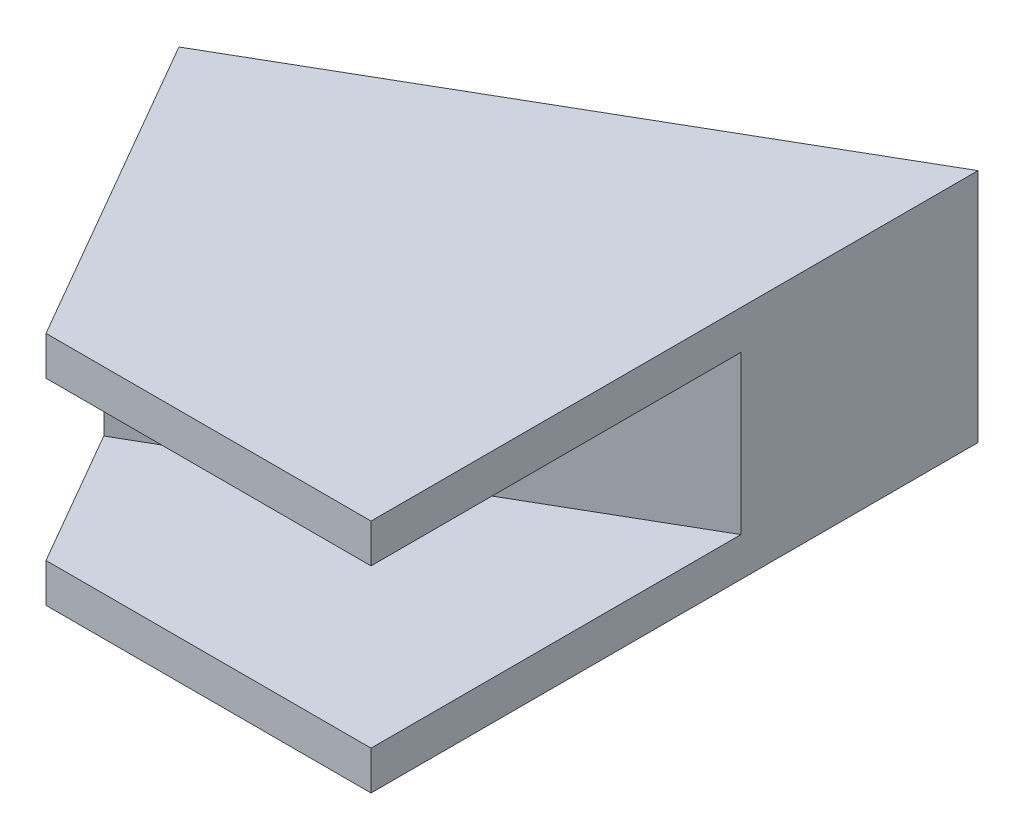
ISO-10303-21;
HEADER;
FILE_DESCRIPTION(('STEP AP214'),'2;1');
FILE_NAME('part.step','',(''),(''),'','','');
FILE_SCHEMA(('AUTOMOTIVE_DESIGN { 1 0 10303 214 1 1 1 1 }'));
ENDSEC;
DATA;
#1=APPLICATION_CONTEXT('core data for automotive mechanical design processes');
#2=APPLICATION_PROTOCOL_DEFINITION('international standard','automotive_design',2000,#1);
#3=PRODUCT_CONTEXT('',#1,'mechanical');
#4=PRODUCT('Part','Part','',(#3));
#5=PRODUCT_RELATED_PRODUCT_CATEGORY('part','',(#4));
#6=PRODUCT_DEFINITION_FORMATION('','',#4);
#7=PRODUCT_DEFINITION_CONTEXT('part definition',#1,'design');
#8=PRODUCT_DEFINITION('design','',#6,#7);
#9=PRODUCT_DEFINITION_SHAPE('','',#8);
#10=(LENGTH_UNIT() NAMED_UNIT(*) SI_UNIT(.MILLI.,.METRE.));
#11=(NAMED_UNIT(*) PLANE_ANGLE_UNIT() SI_UNIT($,.RADIAN.));
#12=(NAMED_UNIT(*) SI_UNIT($,.STERADIAN.) SOLID_ANGLE_UNIT());
#13=UNCERTAINTY_MEASURE_WITH_UNIT(LENGTH_MEASURE(1.E-05),#10,'distance_accuracy_value','');
#14=(GEOMETRIC_REPRESENTATION_CONTEXT(3) GLOBAL_UNCERTAINTY_ASSIGNED_CONTEXT((#13)) GLOBAL_UNIT_ASSIGNED_CONTEXT((#10,
#11,#12)) REPRESENTATION_CONTEXT('',''));
#15=CARTESIAN_POINT('',(0.,0.,0.));
#16=DIRECTION('',(0.,0.,1.));
#17=DIRECTION('',(1.,0.,0.));
#18=AXIS2_PLACEMENT_3D('',#15,#16,#17);
#19=CARTESIAN_POINT('',(0.,5.,0.));
#20=DIRECTION('',(0.,-1.,0.));
#21=DIRECTION('',(0.,0.,-1.));
#22=AXIS2_PLACEMENT_3D('',#19,#20,#21);
#23=PLANE('',#22);
#24=DIRECTION('',(0.866025403784439,0.,-0.5));
#25=VECTOR('',#24,1.);
#26=CARTESIAN_POINT('',(-51.9615242270662,5.,6.55957907090129));
#27=LINE('',#26,#25);
#28=CARTESIAN_POINT('',(-51.9615242270662,5.,6.55957907090129));
#29=VERTEX_POINT('',#28);
#30=CARTESIAN_POINT('',(0.,5.,-23.4404209290987));
#31=VERTEX_POINT('',#30);
#32=EDGE_CURVE('E48',#29,#31,#27,.T.);
#33=ORIENTED_EDGE('',*,*,#32,.F.);
#34=DIRECTION('',(0.500000000000003,0.,0.866025403784437));
#35=VECTOR('',#34,1.);
#36=CARTESIAN_POINT('',(-54.4615242270663,5.,2.22945205197908));
#37=LINE('',#36,#35);
#38=CARTESIAN_POINT('',(-41.8115242270663,5.,24.1398947677253));
#39=VERTEX_POINT('',#38);
#40=EDGE_CURVE('E94',#29,#39,#37,.T.);
#41=ORIENTED_EDGE('',*,*,#40,.T.);
#42=DIRECTION('',(1.,0.,0.));
#43=VECTOR('',#42,1.);
#44=CARTESIAN_POINT('',(-41.8115242270663,5.,24.1398947677253));
#45=LINE('',#44,#43);
#46=CARTESIAN_POINT('',(0.,5.,24.1398947677253));
#47=VERTEX_POINT('',#46);
#48=EDGE_CURVE('E54',#39,#47,#45,.T.);
#49=ORIENTED_EDGE('',*,*,#48,.T.);
#50=DIRECTION('',(0.,0.,-1.));
#51=VECTOR('',#50,1.);
#52=CARTESIAN_POINT('',(0.,5.,24.1398947677253));
#53=LINE('',#52,#51);
#54=EDGE_CURVE('E101',#47,#31,#53,.T.);
#55=ORIENTED_EDGE('',*,*,#54,.T.);
#56=EDGE_LOOP('',(#33,#41,#49,#55));
#57=FACE_BOUND('',#56,.T.);
#58=ADVANCED_FACE('F33',(#57),#23,.F.);
#59=CARTESIAN_POINT('',(-54.4615242270663,5.,2.22945205197908));
#60=DIRECTION('',(0.866025403784438,0.,-0.5));
#61=DIRECTION('',(-0.5,0.,-0.866025403784438));
#62=AXIS2_PLACEMENT_3D('',#59,#60,#61);
#63=PLANE('',#62);
#64=DIRECTION('',(0.5,0.,0.866025403784438));
#65=VECTOR('',#64,1.);
#66=CARTESIAN_POINT('',(-54.4615242270663,0.,2.22945205197908));
#67=LINE('',#66,#65);
#68=CARTESIAN_POINT('',(-65.1667800070896,0.,-16.3125948670415));
#69=VERTEX_POINT('',#68);
#70=CARTESIAN_POINT('',(-41.8115242270663,0.,24.1398947677253));
#71=VERTEX_POINT('',#70);
#72=EDGE_CURVE('E73',#69,#71,#67,.T.);
#73=ORIENTED_EDGE('',*,*,#72,.T.);
#74=DIRECTION('',(0.,-1.,0.));
#75=VECTOR('',#74,1.);
#76=CARTESIAN_POINT('',(-41.8115242270663,5.,24.1398947677253));
#77=LINE('',#76,#75);
#78=EDGE_CURVE('E11',#39,#71,#77,.T.);
#79=ORIENTED_EDGE('',*,*,#78,.F.);
#80=ORIENTED_EDGE('',*,*,#40,.F.);
#81=DIRECTION('',(0.,-1.,0.));
#82=VECTOR('',#81,1.);
#83=CARTESIAN_POINT('',(-51.9615242270662,25.3,6.55957907090129));
#84=LINE('',#83,#82);
#85=CARTESIAN_POINT('',(-51.9615242270662,25.3,6.55957907090129));
#86=VERTEX_POINT('',#85);
#87=EDGE_CURVE('E82',#86,#29,#84,.T.);
#88=ORIENTED_EDGE('',*,*,#87,.F.);
#89=DIRECTION('',(0.500000000000002,0.,0.866025403784438));
#90=VECTOR('',#89,1.);
#91=CARTESIAN_POINT('',(-65.1667800070896,25.3,-16.3125948670415));
#92=LINE('',#91,#90);
#93=CARTESIAN_POINT('',(-41.8115242270663,25.3,24.1398947677253));
#94=VERTEX_POINT('',#93);
#95=EDGE_CURVE('E139',#86,#94,#92,.T.);
#96=ORIENTED_EDGE('',*,*,#95,.T.);
#97=DIRECTION('',(0.,-1.,0.));
#98=VECTOR('',#97,1.);
#99=CARTESIAN_POINT('',(-41.8115242270663,30.3,24.1398947677253));
#100=LINE('',#99,#98);
#101=CARTESIAN_POINT('',(-41.8115242270663,30.3,24.1398947677253));
#102=VERTEX_POINT('',#101);
#103=EDGE_CURVE('E123',#102,#94,#100,.T.);
#104=ORIENTED_EDGE('',*,*,#103,.F.);
#105=DIRECTION('',(0.500000000000002,0.,0.866025403784438));
#106=VECTOR('',#105,1.);
#107=CARTESIAN_POINT('',(-65.1667800070896,30.3,-16.3125948670415));
#108=LINE('',#107,#106);
#109=CARTESIAN_POINT('',(-65.1667800070896,30.3,-16.3125948670415));
#110=VERTEX_POINT('',#109);
#111=EDGE_CURVE('E99',#110,#102,#108,.T.);
#112=ORIENTED_EDGE('',*,*,#111,.F.);
#113=DIRECTION('',(0.,-1.,0.));
#114=VECTOR('',#113,1.);
#115=CARTESIAN_POINT('',(-65.1667800070896,5.,-16.3125948670415));
#116=LINE('',#115,#114);
#117=EDGE_CURVE('E90',#110,#69,#116,.T.);
#118=ORIENTED_EDGE('',*,*,#117,.T.);
#119=EDGE_LOOP('',(#73,#79,#80,#88,#96,#104,#112,#118));
#120=FACE_BOUND('',#119,.T.);
#121=ADVANCED_FACE('F35',(#120),#63,.F.);
#122=CARTESIAN_POINT('',(-41.8115242270663,5.,24.1398947677253));
#123=DIRECTION('',(0.,0.,-1.));
#124=DIRECTION('',(-1.,0.,0.));
#125=AXIS2_PLACEMENT_3D('',#122,#123,#124);
#126=PLANE('',#125);
#127=DIRECTION('',(1.,0.,0.));
#128=VECTOR('',#127,1.);
#129=CARTESIAN_POINT('',(-41.8115242270663,0.,24.1398947677253));
#130=LINE('',#129,#128);
#131=CARTESIAN_POINT('',(0.,0.,24.1398947677253));
#132=VERTEX_POINT('',#131);
#133=EDGE_CURVE('E78',#71,#132,#130,.T.);
#134=ORIENTED_EDGE('',*,*,#133,.T.);
#135=DIRECTION('',(0.,-1.,0.));
#136=VECTOR('',#135,1.);
#137=CARTESIAN_POINT('',(0.,5.,24.1398947677253));
#138=LINE('',#137,#136);
#139=EDGE_CURVE('E41',#47,#132,#138,.T.);
#140=ORIENTED_EDGE('',*,*,#139,.F.);
#141=ORIENTED_EDGE('',*,*,#48,.F.);
#142=ORIENTED_EDGE('',*,*,#78,.T.);
#143=EDGE_LOOP('',(#134,#140,#141,#142));
#144=FACE_BOUND('',#143,.T.);
#145=ADVANCED_FACE('F112',(#144),#126,.F.);
#146=CARTESIAN_POINT('',(0.,5.,-53.9366528463561));
#147=DIRECTION('',(-1.,0.,0.));
#148=DIRECTION('',(0.,0.,1.));
#149=AXIS2_PLACEMENT_3D('',#146,#147,#148);
#150=PLANE('',#149);
#151=DIRECTION('',(0.,0.,-1.));
#152=VECTOR('',#151,1.);
#153=CARTESIAN_POINT('',(0.,0.,-53.9366528463561));
#154=LINE('',#153,#152);
#155=CARTESIAN_POINT('',(0.,0.,-53.9366528463561));
#156=VERTEX_POINT('',#155);
#157=EDGE_CURVE('E95',#132,#156,#154,.T.);
#158=ORIENTED_EDGE('',*,*,#157,.T.);
#159=DIRECTION('',(0.,-1.,0.));
#160=VECTOR('',#159,1.);
#161=CARTESIAN_POINT('',(0.,5.,-53.9366528463561));
#162=LINE('',#161,#160);
#163=CARTESIAN_POINT('',(0.,30.3,-53.9366528463561));
#164=VERTEX_POINT('',#163);
#165=EDGE_CURVE('E93',#164,#156,#162,.T.);
#166=ORIENTED_EDGE('',*,*,#165,.F.);
#167=DIRECTION('',(0.,0.,-1.));
#168=VECTOR('',#167,1.);
#169=CARTESIAN_POINT('',(0.,30.3,24.1398947677253));
#170=LINE('',#169,#168);
#171=CARTESIAN_POINT('',(0.,30.3,24.1398947677253));
#172=VERTEX_POINT('',#171);
#173=EDGE_CURVE('E131',#172,#164,#170,.T.);
#174=ORIENTED_EDGE('',*,*,#173,.F.);
#175=DIRECTION('',(0.,-1.,0.));
#176=VECTOR('',#175,1.);
#177=CARTESIAN_POINT('',(0.,30.3,24.1398947677253));
#178=LINE('',#177,#176);
#179=CARTESIAN_POINT('',(0.,25.3,24.1398947677253));
#180=VERTEX_POINT('',#179);
#181=EDGE_CURVE('E128',#172,#180,#178,.T.);
#182=ORIENTED_EDGE('',*,*,#181,.T.);
#183=DIRECTION('',(0.,0.,-1.));
#184=VECTOR('',#183,1.);
#185=CARTESIAN_POINT('',(0.,25.3,24.1398947677253));
#186=LINE('',#185,#184);
#187=CARTESIAN_POINT('',(0.,25.3,-23.4404209290987));
#188=VERTEX_POINT('',#187);
#189=EDGE_CURVE('E132',#180,#188,#186,.T.);
#190=ORIENTED_EDGE('',*,*,#189,.T.);
#191=DIRECTION('',(0.,-1.,0.));
#192=VECTOR('',#191,1.);
#193=CARTESIAN_POINT('',(0.,25.3,-23.4404209290987));
#194=LINE('',#193,#192);
#195=EDGE_CURVE('E119',#188,#31,#194,.T.);
#196=ORIENTED_EDGE('',*,*,#195,.T.);
#197=ORIENTED_EDGE('',*,*,#54,.F.);
#198=ORIENTED_EDGE('',*,*,#139,.T.);
#199=EDGE_LOOP('',(#158,#166,#174,#182,#190,#196,#197,#198));
#200=FACE_BOUND('',#199,.T.);
#201=ADVANCED_FACE('F109',(#200),#150,.F.);
#202=CARTESIAN_POINT('',(-65.1667800070896,5.,-16.3125948670415));
#203=DIRECTION('',(0.500000000000003,0.,0.866025403784437));
#204=DIRECTION('',(0.866025403784437,0.,-0.500000000000003));
#205=AXIS2_PLACEMENT_3D('',#202,#203,#204);
#206=PLANE('',#205);
#207=DIRECTION('',(-0.866025403784437,0.,0.500000000000003));
#208=VECTOR('',#207,1.);
#209=CARTESIAN_POINT('',(-65.1667800070896,0.,-16.3125948670415));
#210=LINE('',#209,#208);
#211=EDGE_CURVE('E76',#156,#69,#210,.T.);
#212=ORIENTED_EDGE('',*,*,#211,.T.);
#213=ORIENTED_EDGE('',*,*,#117,.F.);
#214=DIRECTION('',(-0.866025403784437,0.,0.500000000000003));
#215=VECTOR('',#214,1.);
#216=CARTESIAN_POINT('',(0.,30.3,-53.9366528463561));
#217=LINE('',#216,#215);
#218=EDGE_CURVE('E135',#164,#110,#217,.T.);
#219=ORIENTED_EDGE('',*,*,#218,.F.);
#220=ORIENTED_EDGE('',*,*,#165,.T.);
#221=EDGE_LOOP('',(#212,#213,#219,#220));
#222=FACE_BOUND('',#221,.T.);
#223=ADVANCED_FACE('F87',(#222),#206,.F.);
#224=CARTESIAN_POINT('',(0.,0.,0.));
#225=DIRECTION('',(0.,-1.,0.));
#226=DIRECTION('',(0.,0.,-1.));
#227=AXIS2_PLACEMENT_3D('',#224,#225,#226);
#228=PLANE('',#227);
#229=ORIENTED_EDGE('',*,*,#72,.F.);
#230=ORIENTED_EDGE('',*,*,#211,.F.);
#231=ORIENTED_EDGE('',*,*,#157,.F.);
#232=ORIENTED_EDGE('',*,*,#133,.F.);
#233=EDGE_LOOP('',(#229,#230,#231,#232));
#234=FACE_BOUND('',#233,.T.);
#235=ADVANCED_FACE('F75',(#234),#228,.T.);
#236=CARTESIAN_POINT('',(-51.9615242270662,25.3,6.55957907090129));
#237=DIRECTION('',(-0.5,0.,-0.866025403784439));
#238=DIRECTION('',(-0.866025403784439,0.,0.5));
#239=AXIS2_PLACEMENT_3D('',#236,#237,#238);
#240=PLANE('',#239);
#241=ORIENTED_EDGE('',*,*,#32,.T.);
#242=ORIENTED_EDGE('',*,*,#195,.F.);
#243=DIRECTION('',(0.866025403784439,0.,-0.5));
#244=VECTOR('',#243,1.);
#245=CARTESIAN_POINT('',(-51.9615242270662,25.3,6.55957907090129));
#246=LINE('',#245,#244);
#247=EDGE_CURVE('E121',#86,#188,#246,.T.);
#248=ORIENTED_EDGE('',*,*,#247,.F.);
#249=ORIENTED_EDGE('',*,*,#87,.T.);
#250=EDGE_LOOP('',(#241,#242,#248,#249));
#251=FACE_BOUND('',#250,.T.);
#252=ADVANCED_FACE('F169',(#251),#240,.F.);
#253=CARTESIAN_POINT('',(0.,25.3,0.));
#254=DIRECTION('',(0.,1.,0.));
#255=DIRECTION('',(0.,0.,1.));
#256=AXIS2_PLACEMENT_3D('',#253,#254,#255);
#257=PLANE('',#256);
#258=ORIENTED_EDGE('',*,*,#95,.F.);
#259=ORIENTED_EDGE('',*,*,#247,.T.);
#260=ORIENTED_EDGE('',*,*,#189,.F.);
#261=DIRECTION('',(1.,0.,0.));
#262=VECTOR('',#261,1.);
#263=CARTESIAN_POINT('',(-41.8115242270663,25.3,24.1398947677253));
#264=LINE('',#263,#262);
#265=EDGE_CURVE('E136',#94,#180,#264,.T.);
#266=ORIENTED_EDGE('',*,*,#265,.F.);
#267=EDGE_LOOP('',(#258,#259,#260,#266));
#268=FACE_BOUND('',#267,.T.);
#269=ADVANCED_FACE('F176',(#268),#257,.F.);
#270=CARTESIAN_POINT('',(-41.8115242270663,30.3,24.1398947677253));
#271=DIRECTION('',(0.,0.,-1.));
#272=DIRECTION('',(-1.,0.,0.));
#273=AXIS2_PLACEMENT_3D('',#270,#271,#272);
#274=PLANE('',#273);
#275=ORIENTED_EDGE('',*,*,#265,.T.);
#276=ORIENTED_EDGE('',*,*,#181,.F.);
#277=DIRECTION('',(1.,0.,0.));
#278=VECTOR('',#277,1.);
#279=CARTESIAN_POINT('',(-41.8115242270663,30.3,24.1398947677253));
#280=LINE('',#279,#278);
#281=EDGE_CURVE('E144',#102,#172,#280,.T.);
#282=ORIENTED_EDGE('',*,*,#281,.F.);
#283=ORIENTED_EDGE('',*,*,#103,.T.);
#284=EDGE_LOOP('',(#275,#276,#282,#283));
#285=FACE_BOUND('',#284,.T.);
#286=ADVANCED_FACE('F179',(#285),#274,.F.);
#287=CARTESIAN_POINT('',(0.,30.3,0.));
#288=DIRECTION('',(0.,1.,0.));
#289=DIRECTION('',(0.,0.,1.));
#290=AXIS2_PLACEMENT_3D('',#287,#288,#289);
#291=PLANE('',#290);
#292=ORIENTED_EDGE('',*,*,#218,.T.);
#293=ORIENTED_EDGE('',*,*,#111,.T.);
#294=ORIENTED_EDGE('',*,*,#281,.T.);
#295=ORIENTED_EDGE('',*,*,#173,.T.);
#296=EDGE_LOOP('',(#292,#293,#294,#295));
#297=FACE_BOUND('',#296,.T.);
#298=ADVANCED_FACE('F149',(#297),#291,.T.);
#299=CLOSED_SHELL('',(#58,#121,#145,#201,#223,#235,#252,#269,#286,#298));
#300=MANIFOLD_SOLID_BREP('B2',#299);
#301=ADVANCED_BREP_SHAPE_REPRESENTATION('',(#18,#300),#14);
#302=SHAPE_DEFINITION_REPRESENTATION(#9,#301);
ENDSEC;
END-ISO-10303-21;
